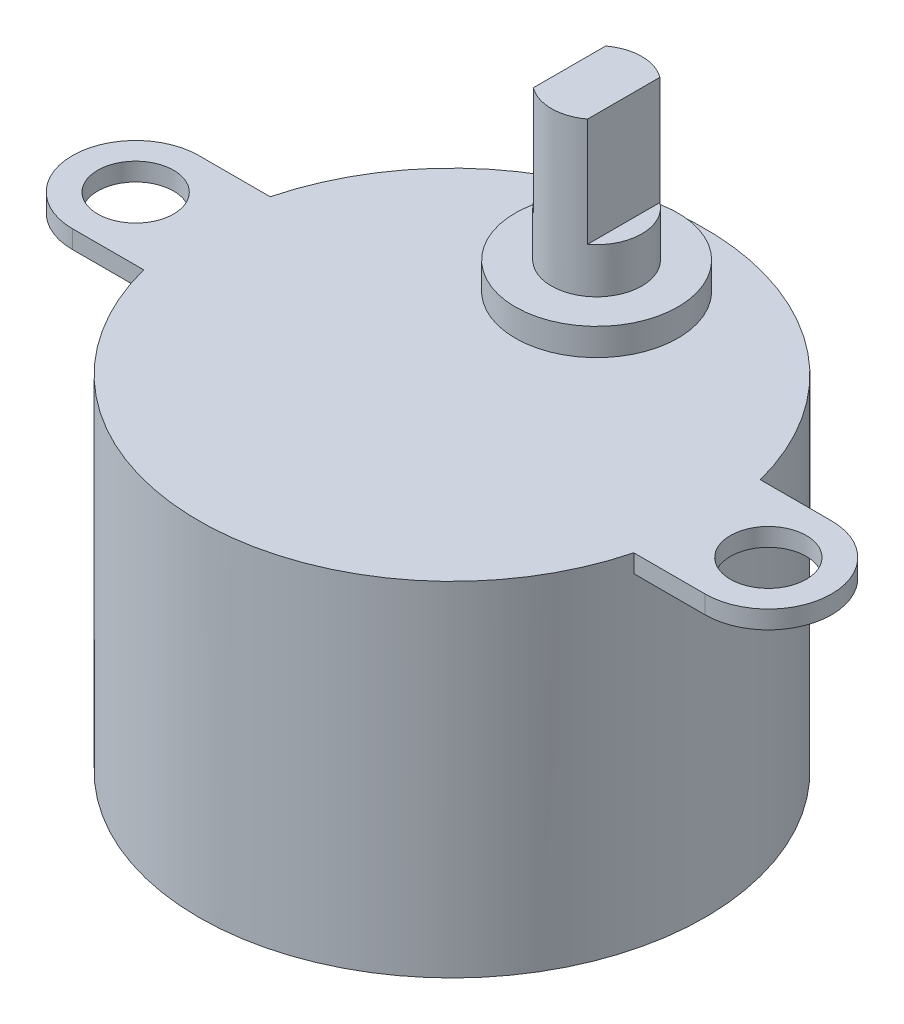
ISO-10303-21;
HEADER;
FILE_DESCRIPTION(('STEP AP214'),'2;1');
FILE_NAME('part.step','',(''),(''),'','','');
FILE_SCHEMA(('AUTOMOTIVE_DESIGN { 1 0 10303 214 1 1 1 1 }'));
ENDSEC;
DATA;
#1=APPLICATION_CONTEXT('core data for automotive mechanical design processes');
#2=APPLICATION_PROTOCOL_DEFINITION('international standard','automotive_design',2000,#1);
#3=PRODUCT_CONTEXT('',#1,'mechanical');
#4=PRODUCT('Part','Part','',(#3));
#5=PRODUCT_RELATED_PRODUCT_CATEGORY('part','',(#4));
#6=PRODUCT_DEFINITION_FORMATION('','',#4);
#7=PRODUCT_DEFINITION_CONTEXT('part definition',#1,'design');
#8=PRODUCT_DEFINITION('design','',#6,#7);
#9=PRODUCT_DEFINITION_SHAPE('','',#8);
#10=(LENGTH_UNIT() NAMED_UNIT(*) SI_UNIT(.MILLI.,.METRE.));
#11=(NAMED_UNIT(*) PLANE_ANGLE_UNIT() SI_UNIT($,.RADIAN.));
#12=(NAMED_UNIT(*) SI_UNIT($,.STERADIAN.) SOLID_ANGLE_UNIT());
#13=UNCERTAINTY_MEASURE_WITH_UNIT(LENGTH_MEASURE(1.E-05),#10,'distance_accuracy_value','');
#14=(GEOMETRIC_REPRESENTATION_CONTEXT(3) GLOBAL_UNCERTAINTY_ASSIGNED_CONTEXT((#13)) GLOBAL_UNIT_ASSIGNED_CONTEXT((#10,
#11,#12)) REPRESENTATION_CONTEXT('',''));
#15=CARTESIAN_POINT('',(0.,0.,0.));
#16=DIRECTION('',(0.,0.,1.));
#17=DIRECTION('',(1.,0.,0.));
#18=AXIS2_PLACEMENT_3D('',#15,#16,#17);
#19=CARTESIAN_POINT('',(0.,23.,-8.));
#20=DIRECTION('',(0.,1.,0.));
#21=DIRECTION('',(0.,0.,1.));
#22=AXIS2_PLACEMENT_3D('',#19,#20,#21);
#23=PLANE('',#22);
#24=DIRECTION('',(0.,0.,-1.));
#25=VECTOR('',#24,1.);
#26=CARTESIAN_POINT('',(1.5,23.,-10.));
#27=LINE('',#26,#25);
#28=CARTESIAN_POINT('',(1.5,23.,-6.));
#29=VERTEX_POINT('',#28);
#30=CARTESIAN_POINT('',(1.5,23.,-10.));
#31=VERTEX_POINT('',#30);
#32=EDGE_CURVE('E146',#29,#31,#27,.T.);
#33=ORIENTED_EDGE('',*,*,#32,.F.);
#34=CARTESIAN_POINT('',(0.,23.,-8.));
#35=DIRECTION('',(0.,1.,0.));
#36=DIRECTION('',(0.,0.,1.));
#37=AXIS2_PLACEMENT_3D('',#34,#35,#36);
#38=CIRCLE('',#37,2.5);
#39=EDGE_CURVE('E59',#29,#31,#38,.T.);
#40=ORIENTED_EDGE('',*,*,#39,.T.);
#41=EDGE_LOOP('',(#33,#40));
#42=FACE_BOUND('',#41,.T.);
#43=ADVANCED_FACE('F36',(#42),#23,.T.);
#44=CARTESIAN_POINT('',(0.,19.,0.));
#45=DIRECTION('',(0.,-1.,0.));
#46=DIRECTION('',(0.,0.,-1.));
#47=AXIS2_PLACEMENT_3D('',#44,#45,#46);
#48=CYLINDRICAL_SURFACE('',#47,14.);
#49=CARTESIAN_POINT('',(0.,19.,0.));
#50=DIRECTION('',(0.,1.,0.));
#51=DIRECTION('',(0.,0.,1.));
#52=AXIS2_PLACEMENT_3D('',#49,#50,#51);
#53=CIRCLE('',#52,14.);
#54=CARTESIAN_POINT('',(13.555441711726,19.,-3.5));
#55=VERTEX_POINT('',#54);
#56=CARTESIAN_POINT('',(-13.555441711726,19.,-3.5));
#57=VERTEX_POINT('',#56);
#58=EDGE_CURVE('E226',#55,#57,#53,.T.);
#59=ORIENTED_EDGE('',*,*,#58,.F.);
#60=DIRECTION('',(0.,-1.,0.));
#61=VECTOR('',#60,1.);
#62=CARTESIAN_POINT('',(13.555441711726,19.,-3.5));
#63=LINE('',#62,#61);
#64=CARTESIAN_POINT('',(13.555441711726,18.,-3.5));
#65=VERTEX_POINT('',#64);
#66=EDGE_CURVE('E220',#55,#65,#63,.T.);
#67=ORIENTED_EDGE('',*,*,#66,.T.);
#68=CARTESIAN_POINT('',(0.,18.,0.));
#69=DIRECTION('',(0.,1.,0.));
#70=DIRECTION('',(0.,0.,1.));
#71=AXIS2_PLACEMENT_3D('',#68,#69,#70);
#72=CIRCLE('',#71,14.);
#73=CARTESIAN_POINT('',(13.555441711726,18.,3.5));
#74=VERTEX_POINT('',#73);
#75=EDGE_CURVE('E45',#74,#65,#72,.T.);
#76=ORIENTED_EDGE('',*,*,#75,.F.);
#77=DIRECTION('',(0.,-1.,0.));
#78=VECTOR('',#77,1.);
#79=CARTESIAN_POINT('',(13.555441711726,19.,3.5));
#80=LINE('',#79,#78);
#81=CARTESIAN_POINT('',(13.555441711726,19.,3.5));
#82=VERTEX_POINT('',#81);
#83=EDGE_CURVE('E205',#74,#82,#80,.F.);
#84=ORIENTED_EDGE('',*,*,#83,.T.);
#85=CARTESIAN_POINT('',(-13.555441711726,19.,3.5));
#86=VERTEX_POINT('',#85);
#87=EDGE_CURVE('E224',#86,#82,#53,.T.);
#88=ORIENTED_EDGE('',*,*,#87,.F.);
#89=DIRECTION('',(0.,-1.,0.));
#90=VECTOR('',#89,1.);
#91=CARTESIAN_POINT('',(-13.555441711726,19.,3.5));
#92=LINE('',#91,#90);
#93=CARTESIAN_POINT('',(-13.555441711726,18.,3.5));
#94=VERTEX_POINT('',#93);
#95=EDGE_CURVE('E214',#86,#94,#92,.T.);
#96=ORIENTED_EDGE('',*,*,#95,.T.);
#97=CARTESIAN_POINT('',(-13.555441711726,18.,-3.5));
#98=VERTEX_POINT('',#97);
#99=EDGE_CURVE('E40',#98,#94,#72,.T.);
#100=ORIENTED_EDGE('',*,*,#99,.F.);
#101=DIRECTION('',(0.,-1.,0.));
#102=VECTOR('',#101,1.);
#103=CARTESIAN_POINT('',(-13.555441711726,19.,-3.5));
#104=LINE('',#103,#102);
#105=EDGE_CURVE('E217',#98,#57,#104,.F.);
#106=ORIENTED_EDGE('',*,*,#105,.T.);
#107=EDGE_LOOP('',(#59,#67,#76,#84,#88,#96,#100,#106));
#108=FACE_BOUND('',#107,.T.);
#109=CARTESIAN_POINT('',(0.,0.,0.));
#110=DIRECTION('',(0.,1.,0.));
#111=DIRECTION('',(0.,0.,1.));
#112=AXIS2_PLACEMENT_3D('',#109,#110,#111);
#113=CIRCLE('',#112,14.);
#114=CARTESIAN_POINT('',(0.,0.,14.));
#115=VERTEX_POINT('',#114);
#116=EDGE_CURVE('E223',#115,#115,#113,.T.);
#117=ORIENTED_EDGE('',*,*,#116,.T.);
#118=EDGE_LOOP('',(#117));
#119=FACE_BOUND('',#118,.T.);
#120=ADVANCED_FACE('F38',(#108,#119),#48,.T.);
#121=CARTESIAN_POINT('',(0.,19.,0.));
#122=DIRECTION('',(0.,1.,0.));
#123=DIRECTION('',(0.,0.,1.));
#124=AXIS2_PLACEMENT_3D('',#121,#122,#123);
#125=PLANE('',#124);
#126=CARTESIAN_POINT('',(0.,19.,-8.));
#127=DIRECTION('',(0.,1.,0.));
#128=DIRECTION('',(0.,0.,1.));
#129=AXIS2_PLACEMENT_3D('',#126,#127,#128);
#130=CIRCLE('',#129,4.5);
#131=CARTESIAN_POINT('',(0.,19.,-3.5));
#132=VERTEX_POINT('',#131);
#133=EDGE_CURVE('E156',#132,#132,#130,.T.);
#134=ORIENTED_EDGE('',*,*,#133,.F.);
#135=EDGE_LOOP('',(#134));
#136=FACE_BOUND('',#135,.T.);
#137=ORIENTED_EDGE('',*,*,#87,.T.);
#138=DIRECTION('',(1.,0.,0.));
#139=VECTOR('',#138,1.);
#140=CARTESIAN_POINT('',(-17.5,19.,3.5));
#141=LINE('',#140,#139);
#142=CARTESIAN_POINT('',(17.5,19.,3.5));
#143=VERTEX_POINT('',#142);
#144=EDGE_CURVE('E194',#82,#143,#141,.T.);
#145=ORIENTED_EDGE('',*,*,#144,.T.);
#146=CARTESIAN_POINT('',(17.5,19.,0.));
#147=DIRECTION('',(0.,1.,0.));
#148=DIRECTION('',(0.,0.,1.));
#149=AXIS2_PLACEMENT_3D('',#146,#147,#148);
#150=CIRCLE('',#149,3.5);
#151=CARTESIAN_POINT('',(17.5,19.,-3.5));
#152=VERTEX_POINT('',#151);
#153=EDGE_CURVE('E197',#143,#152,#150,.T.);
#154=ORIENTED_EDGE('',*,*,#153,.T.);
#155=DIRECTION('',(-1.,0.,0.));
#156=VECTOR('',#155,1.);
#157=CARTESIAN_POINT('',(-17.5,19.,-3.5));
#158=LINE('',#157,#156);
#159=EDGE_CURVE('E180',#152,#55,#158,.T.);
#160=ORIENTED_EDGE('',*,*,#159,.T.);
#161=ORIENTED_EDGE('',*,*,#58,.T.);
#162=CARTESIAN_POINT('',(-17.5,19.,-3.5));
#163=VERTEX_POINT('',#162);
#164=EDGE_CURVE('E200',#57,#163,#158,.T.);
#165=ORIENTED_EDGE('',*,*,#164,.T.);
#166=CARTESIAN_POINT('',(-17.5,19.,0.));
#167=DIRECTION('',(0.,1.,0.));
#168=DIRECTION('',(0.,0.,1.));
#169=AXIS2_PLACEMENT_3D('',#166,#167,#168);
#170=CIRCLE('',#169,3.5);
#171=CARTESIAN_POINT('',(-17.5,19.,3.5));
#172=VERTEX_POINT('',#171);
#173=EDGE_CURVE('E173',#163,#172,#170,.T.);
#174=ORIENTED_EDGE('',*,*,#173,.T.);
#175=EDGE_CURVE('E195',#172,#86,#141,.T.);
#176=ORIENTED_EDGE('',*,*,#175,.T.);
#177=EDGE_LOOP('',(#137,#145,#154,#160,#161,#165,#174,#176));
#178=FACE_BOUND('',#177,.T.);
#179=CARTESIAN_POINT('',(-17.5,19.,0.));
#180=DIRECTION('',(0.,1.,0.));
#181=DIRECTION('',(0.,0.,1.));
#182=AXIS2_PLACEMENT_3D('',#179,#180,#181);
#183=CIRCLE('',#182,2.1);
#184=CARTESIAN_POINT('',(-17.5,19.,2.1));
#185=VERTEX_POINT('',#184);
#186=EDGE_CURVE('E167',#185,#185,#183,.T.);
#187=ORIENTED_EDGE('',*,*,#186,.F.);
#188=EDGE_LOOP('',(#187));
#189=FACE_BOUND('',#188,.T.);
#190=CARTESIAN_POINT('',(17.5,19.,0.));
#191=DIRECTION('',(0.,1.,0.));
#192=DIRECTION('',(0.,0.,1.));
#193=AXIS2_PLACEMENT_3D('',#190,#191,#192);
#194=CIRCLE('',#193,2.1);
#195=CARTESIAN_POINT('',(17.5,19.,2.1));
#196=VERTEX_POINT('',#195);
#197=EDGE_CURVE('E161',#196,#196,#194,.T.);
#198=ORIENTED_EDGE('',*,*,#197,.F.);
#199=EDGE_LOOP('',(#198));
#200=FACE_BOUND('',#199,.T.);
#201=ADVANCED_FACE('F234',(#136,#178,#189,#200),#125,.T.);
#202=CARTESIAN_POINT('',(0.,0.,0.));
#203=DIRECTION('',(0.,1.,0.));
#204=DIRECTION('',(0.,0.,1.));
#205=AXIS2_PLACEMENT_3D('',#202,#203,#204);
#206=PLANE('',#205);
#207=ORIENTED_EDGE('',*,*,#116,.F.);
#208=EDGE_LOOP('',(#207));
#209=FACE_BOUND('',#208,.T.);
#210=ADVANCED_FACE('F231',(#209),#206,.F.);
#211=CARTESIAN_POINT('',(-17.5,18.,0.));
#212=DIRECTION('',(0.,1.,0.));
#213=DIRECTION('',(0.,0.,1.));
#214=AXIS2_PLACEMENT_3D('',#211,#212,#213);
#215=CYLINDRICAL_SURFACE('',#214,2.1);
#216=CARTESIAN_POINT('',(-17.5,18.,0.));
#217=DIRECTION('',(0.,1.,0.));
#218=DIRECTION('',(0.,0.,1.));
#219=AXIS2_PLACEMENT_3D('',#216,#217,#218);
#220=CIRCLE('',#219,2.1);
#221=CARTESIAN_POINT('',(-17.5,18.,2.1));
#222=VERTEX_POINT('',#221);
#223=EDGE_CURVE('E170',#222,#222,#220,.T.);
#224=ORIENTED_EDGE('',*,*,#223,.F.);
#225=EDGE_LOOP('',(#224));
#226=FACE_BOUND('',#225,.T.);
#227=ORIENTED_EDGE('',*,*,#186,.T.);
#228=EDGE_LOOP('',(#227));
#229=FACE_BOUND('',#228,.T.);
#230=ADVANCED_FACE('F233',(#226,#229),#215,.F.);
#231=CARTESIAN_POINT('',(-17.5,18.,0.));
#232=DIRECTION('',(0.,1.,0.));
#233=DIRECTION('',(0.,0.,1.));
#234=AXIS2_PLACEMENT_3D('',#231,#232,#233);
#235=CYLINDRICAL_SURFACE('',#234,3.5);
#236=ORIENTED_EDGE('',*,*,#173,.F.);
#237=DIRECTION('',(0.,1.,0.));
#238=VECTOR('',#237,1.);
#239=CARTESIAN_POINT('',(-17.5,18.,-3.5));
#240=LINE('',#239,#238);
#241=CARTESIAN_POINT('',(-17.5,18.,-3.5));
#242=VERTEX_POINT('',#241);
#243=EDGE_CURVE('E202',#242,#163,#240,.T.);
#244=ORIENTED_EDGE('',*,*,#243,.F.);
#245=CARTESIAN_POINT('',(-17.5,18.,0.));
#246=DIRECTION('',(0.,1.,0.));
#247=DIRECTION('',(0.,0.,1.));
#248=AXIS2_PLACEMENT_3D('',#245,#246,#247);
#249=CIRCLE('',#248,3.5);
#250=CARTESIAN_POINT('',(-17.5,18.,3.5));
#251=VERTEX_POINT('',#250);
#252=EDGE_CURVE('E176',#242,#251,#249,.T.);
#253=ORIENTED_EDGE('',*,*,#252,.T.);
#254=DIRECTION('',(0.,1.,0.));
#255=VECTOR('',#254,1.);
#256=CARTESIAN_POINT('',(-17.5,18.,3.5));
#257=LINE('',#256,#255);
#258=EDGE_CURVE('E191',#251,#172,#257,.T.);
#259=ORIENTED_EDGE('',*,*,#258,.T.);
#260=EDGE_LOOP('',(#236,#244,#253,#259));
#261=FACE_BOUND('',#260,.T.);
#262=ADVANCED_FACE('F239',(#261),#235,.T.);
#263=CARTESIAN_POINT('',(-17.5,18.,0.));
#264=DIRECTION('',(0.,1.,0.));
#265=DIRECTION('',(0.,0.,1.));
#266=AXIS2_PLACEMENT_3D('',#263,#264,#265);
#267=PLANE('',#266);
#268=ORIENTED_EDGE('',*,*,#223,.T.);
#269=EDGE_LOOP('',(#268));
#270=FACE_BOUND('',#269,.T.);
#271=DIRECTION('',(-1.,0.,0.));
#272=VECTOR('',#271,1.);
#273=CARTESIAN_POINT('',(-17.5,18.,-3.5));
#274=LINE('',#273,#272);
#275=EDGE_CURVE('E187',#98,#242,#274,.T.);
#276=ORIENTED_EDGE('',*,*,#275,.F.);
#277=ORIENTED_EDGE('',*,*,#99,.T.);
#278=DIRECTION('',(1.,0.,0.));
#279=VECTOR('',#278,1.);
#280=CARTESIAN_POINT('',(-17.5,18.,3.5));
#281=LINE('',#280,#279);
#282=EDGE_CURVE('E181',#251,#94,#281,.T.);
#283=ORIENTED_EDGE('',*,*,#282,.F.);
#284=ORIENTED_EDGE('',*,*,#252,.F.);
#285=EDGE_LOOP('',(#276,#277,#283,#284));
#286=FACE_BOUND('',#285,.T.);
#287=ADVANCED_FACE('F275',(#270,#286),#267,.F.);
#288=CARTESIAN_POINT('',(-17.5,18.,3.5));
#289=DIRECTION('',(0.,0.,1.));
#290=DIRECTION('',(1.,0.,0.));
#291=AXIS2_PLACEMENT_3D('',#288,#289,#290);
#292=PLANE('',#291);
#293=ORIENTED_EDGE('',*,*,#95,.F.);
#294=ORIENTED_EDGE('',*,*,#175,.F.);
#295=ORIENTED_EDGE('',*,*,#258,.F.);
#296=ORIENTED_EDGE('',*,*,#282,.T.);
#297=EDGE_LOOP('',(#293,#294,#295,#296));
#298=FACE_BOUND('',#297,.T.);
#299=ADVANCED_FACE('F278',(#298),#292,.T.);
#300=CARTESIAN_POINT('',(-17.5,18.,-3.5));
#301=DIRECTION('',(0.,0.,-1.));
#302=DIRECTION('',(-1.,0.,0.));
#303=AXIS2_PLACEMENT_3D('',#300,#301,#302);
#304=PLANE('',#303);
#305=ORIENTED_EDGE('',*,*,#105,.F.);
#306=ORIENTED_EDGE('',*,*,#275,.T.);
#307=ORIENTED_EDGE('',*,*,#243,.T.);
#308=ORIENTED_EDGE('',*,*,#164,.F.);
#309=EDGE_LOOP('',(#305,#306,#307,#308));
#310=FACE_BOUND('',#309,.T.);
#311=ADVANCED_FACE('F286',(#310),#304,.T.);
#312=CARTESIAN_POINT('',(17.5,18.,0.));
#313=DIRECTION('',(0.,1.,0.));
#314=DIRECTION('',(0.,0.,1.));
#315=AXIS2_PLACEMENT_3D('',#312,#313,#314);
#316=CIRCLE('',#315,2.1);
#317=CARTESIAN_POINT('',(17.5,18.,2.1));
#318=VERTEX_POINT('',#317);
#319=EDGE_CURVE('E164',#318,#318,#316,.T.);
#320=ORIENTED_EDGE('',*,*,#319,.T.);
#321=EDGE_LOOP('',(#320));
#322=FACE_BOUND('',#321,.T.);
#323=CARTESIAN_POINT('',(17.5,18.,3.5));
#324=VERTEX_POINT('',#323);
#325=EDGE_CURVE('E179',#74,#324,#281,.T.);
#326=ORIENTED_EDGE('',*,*,#325,.F.);
#327=ORIENTED_EDGE('',*,*,#75,.T.);
#328=CARTESIAN_POINT('',(17.5,18.,-3.5));
#329=VERTEX_POINT('',#328);
#330=EDGE_CURVE('E188',#329,#65,#274,.T.);
#331=ORIENTED_EDGE('',*,*,#330,.F.);
#332=CARTESIAN_POINT('',(17.5,18.,0.));
#333=DIRECTION('',(0.,1.,0.));
#334=DIRECTION('',(0.,0.,1.));
#335=AXIS2_PLACEMENT_3D('',#332,#333,#334);
#336=CIRCLE('',#335,3.5);
#337=EDGE_CURVE('E184',#324,#329,#336,.T.);
#338=ORIENTED_EDGE('',*,*,#337,.F.);
#339=EDGE_LOOP('',(#326,#327,#331,#338));
#340=FACE_BOUND('',#339,.T.);
#341=ADVANCED_FACE('F280',(#322,#340),#267,.F.);
#342=ORIENTED_EDGE('',*,*,#66,.F.);
#343=ORIENTED_EDGE('',*,*,#159,.F.);
#344=DIRECTION('',(0.,1.,0.));
#345=VECTOR('',#344,1.);
#346=CARTESIAN_POINT('',(17.5,18.,-3.5));
#347=LINE('',#346,#345);
#348=EDGE_CURVE('E206',#329,#152,#347,.T.);
#349=ORIENTED_EDGE('',*,*,#348,.F.);
#350=ORIENTED_EDGE('',*,*,#330,.T.);
#351=EDGE_LOOP('',(#342,#343,#349,#350));
#352=FACE_BOUND('',#351,.T.);
#353=ADVANCED_FACE('F281',(#352),#304,.T.);
#354=ORIENTED_EDGE('',*,*,#83,.F.);
#355=ORIENTED_EDGE('',*,*,#325,.T.);
#356=DIRECTION('',(0.,1.,0.));
#357=VECTOR('',#356,1.);
#358=CARTESIAN_POINT('',(17.5,18.,3.5));
#359=LINE('',#358,#357);
#360=EDGE_CURVE('E208',#324,#143,#359,.T.);
#361=ORIENTED_EDGE('',*,*,#360,.T.);
#362=ORIENTED_EDGE('',*,*,#144,.F.);
#363=EDGE_LOOP('',(#354,#355,#361,#362));
#364=FACE_BOUND('',#363,.T.);
#365=ADVANCED_FACE('F284',(#364),#292,.T.);
#366=CARTESIAN_POINT('',(17.5,18.,0.));
#367=DIRECTION('',(0.,1.,0.));
#368=DIRECTION('',(0.,0.,1.));
#369=AXIS2_PLACEMENT_3D('',#366,#367,#368);
#370=CYLINDRICAL_SURFACE('',#369,3.5);
#371=ORIENTED_EDGE('',*,*,#153,.F.);
#372=ORIENTED_EDGE('',*,*,#360,.F.);
#373=ORIENTED_EDGE('',*,*,#337,.T.);
#374=ORIENTED_EDGE('',*,*,#348,.T.);
#375=EDGE_LOOP('',(#371,#372,#373,#374));
#376=FACE_BOUND('',#375,.T.);
#377=ADVANCED_FACE('F272',(#376),#370,.T.);
#378=CARTESIAN_POINT('',(17.5,18.,0.));
#379=DIRECTION('',(0.,1.,0.));
#380=DIRECTION('',(0.,0.,1.));
#381=AXIS2_PLACEMENT_3D('',#378,#379,#380);
#382=CYLINDRICAL_SURFACE('',#381,2.1);
#383=ORIENTED_EDGE('',*,*,#319,.F.);
#384=EDGE_LOOP('',(#383));
#385=FACE_BOUND('',#384,.T.);
#386=ORIENTED_EDGE('',*,*,#197,.T.);
#387=EDGE_LOOP('',(#386));
#388=FACE_BOUND('',#387,.T.);
#389=ADVANCED_FACE('F269',(#385,#388),#382,.F.);
#390=CARTESIAN_POINT('',(0.,20.5,-8.));
#391=DIRECTION('',(0.,-1.,0.));
#392=DIRECTION('',(0.,0.,-1.));
#393=AXIS2_PLACEMENT_3D('',#390,#391,#392);
#394=CYLINDRICAL_SURFACE('',#393,4.5);
#395=CARTESIAN_POINT('',(0.,20.5,-8.));
#396=DIRECTION('',(0.,1.,0.));
#397=DIRECTION('',(0.,0.,1.));
#398=AXIS2_PLACEMENT_3D('',#395,#396,#397);
#399=CIRCLE('',#398,4.5);
#400=CARTESIAN_POINT('',(0.,20.5,-3.5));
#401=VERTEX_POINT('',#400);
#402=EDGE_CURVE('E158',#401,#401,#399,.T.);
#403=ORIENTED_EDGE('',*,*,#402,.F.);
#404=EDGE_LOOP('',(#403));
#405=FACE_BOUND('',#404,.T.);
#406=ORIENTED_EDGE('',*,*,#133,.T.);
#407=EDGE_LOOP('',(#406));
#408=FACE_BOUND('',#407,.T.);
#409=ADVANCED_FACE('F263',(#405,#408),#394,.T.);
#410=CARTESIAN_POINT('',(0.,20.5,-8.));
#411=DIRECTION('',(0.,1.,0.));
#412=DIRECTION('',(0.,0.,1.));
#413=AXIS2_PLACEMENT_3D('',#410,#411,#412);
#414=PLANE('',#413);
#415=CARTESIAN_POINT('',(0.,20.5,-8.));
#416=DIRECTION('',(0.,1.,0.));
#417=DIRECTION('',(0.,0.,1.));
#418=AXIS2_PLACEMENT_3D('',#415,#416,#417);
#419=CIRCLE('',#418,2.5);
#420=CARTESIAN_POINT('',(0.,20.5,-5.5));
#421=VERTEX_POINT('',#420);
#422=EDGE_CURVE('E11',#421,#421,#419,.T.);
#423=ORIENTED_EDGE('',*,*,#422,.F.);
#424=EDGE_LOOP('',(#423));
#425=FACE_BOUND('',#424,.T.);
#426=ORIENTED_EDGE('',*,*,#402,.T.);
#427=EDGE_LOOP('',(#426));
#428=FACE_BOUND('',#427,.T.);
#429=ADVANCED_FACE('F259',(#425,#428),#414,.T.);
#430=CARTESIAN_POINT('',(0.,23.,-8.));
#431=DIRECTION('',(0.,-1.,0.));
#432=DIRECTION('',(0.,0.,-1.));
#433=AXIS2_PLACEMENT_3D('',#430,#431,#432);
#434=CYLINDRICAL_SURFACE('',#433,2.5);
#435=ORIENTED_EDGE('',*,*,#39,.F.);
#436=DIRECTION('',(0.,-1.,0.));
#437=VECTOR('',#436,1.);
#438=CARTESIAN_POINT('',(1.5,29.,-6.));
#439=LINE('',#438,#437);
#440=CARTESIAN_POINT('',(1.5,29.,-6.));
#441=VERTEX_POINT('',#440);
#442=EDGE_CURVE('E153',#441,#29,#439,.T.);
#443=ORIENTED_EDGE('',*,*,#442,.F.);
#444=CARTESIAN_POINT('',(0.,29.,-8.));
#445=DIRECTION('',(0.,1.,0.));
#446=DIRECTION('',(0.,0.,1.));
#447=AXIS2_PLACEMENT_3D('',#444,#445,#446);
#448=CIRCLE('',#447,2.5);
#449=CARTESIAN_POINT('',(-1.5,29.,-6.));
#450=VERTEX_POINT('',#449);
#451=EDGE_CURVE('E136',#450,#441,#448,.T.);
#452=ORIENTED_EDGE('',*,*,#451,.F.);
#453=DIRECTION('',(0.,-1.,0.));
#454=VECTOR('',#453,1.);
#455=CARTESIAN_POINT('',(-1.5,29.,-6.));
#456=LINE('',#455,#454);
#457=CARTESIAN_POINT('',(-1.5,23.,-6.));
#458=VERTEX_POINT('',#457);
#459=EDGE_CURVE('E133',#450,#458,#456,.T.);
#460=ORIENTED_EDGE('',*,*,#459,.T.);
#461=CARTESIAN_POINT('',(-1.5,23.,-10.));
#462=VERTEX_POINT('',#461);
#463=EDGE_CURVE('E150',#462,#458,#38,.T.);
#464=ORIENTED_EDGE('',*,*,#463,.F.);
#465=DIRECTION('',(0.,-1.,0.));
#466=VECTOR('',#465,1.);
#467=CARTESIAN_POINT('',(-1.5,29.,-10.));
#468=LINE('',#467,#466);
#469=CARTESIAN_POINT('',(-1.5,29.,-10.));
#470=VERTEX_POINT('',#469);
#471=EDGE_CURVE('E131',#470,#462,#468,.T.);
#472=ORIENTED_EDGE('',*,*,#471,.F.);
#473=CARTESIAN_POINT('',(0.,29.,-8.));
#474=DIRECTION('',(0.,1.,0.));
#475=DIRECTION('',(0.,0.,1.));
#476=AXIS2_PLACEMENT_3D('',#473,#474,#475);
#477=CIRCLE('',#476,2.5);
#478=CARTESIAN_POINT('',(1.5,29.,-10.));
#479=VERTEX_POINT('',#478);
#480=EDGE_CURVE('E137',#479,#470,#477,.T.);
#481=ORIENTED_EDGE('',*,*,#480,.F.);
#482=DIRECTION('',(0.,-1.,0.));
#483=VECTOR('',#482,1.);
#484=CARTESIAN_POINT('',(1.5,29.,-10.));
#485=LINE('',#484,#483);
#486=EDGE_CURVE('E387',#479,#31,#485,.T.);
#487=ORIENTED_EDGE('',*,*,#486,.T.);
#488=EDGE_LOOP('',(#435,#443,#452,#460,#464,#472,#481,#487));
#489=FACE_BOUND('',#488,.T.);
#490=ORIENTED_EDGE('',*,*,#422,.T.);
#491=EDGE_LOOP('',(#490));
#492=FACE_BOUND('',#491,.T.);
#493=ADVANCED_FACE('F148',(#489,#492),#434,.T.);
#494=DIRECTION('',(0.,0.,1.));
#495=VECTOR('',#494,1.);
#496=CARTESIAN_POINT('',(-1.5,23.,-10.));
#497=LINE('',#496,#495);
#498=EDGE_CURVE('E52',#462,#458,#497,.T.);
#499=ORIENTED_EDGE('',*,*,#498,.F.);
#500=ORIENTED_EDGE('',*,*,#463,.T.);
#501=EDGE_LOOP('',(#499,#500));
#502=FACE_BOUND('',#501,.T.);
#503=ADVANCED_FACE('F246',(#502),#23,.T.);
#504=CARTESIAN_POINT('',(-1.5,29.,-10.));
#505=DIRECTION('',(1.,0.,0.));
#506=DIRECTION('',(0.,0.,-1.));
#507=AXIS2_PLACEMENT_3D('',#504,#505,#506);
#508=PLANE('',#507);
#509=ORIENTED_EDGE('',*,*,#498,.T.);
#510=ORIENTED_EDGE('',*,*,#459,.F.);
#511=DIRECTION('',(0.,0.,1.));
#512=VECTOR('',#511,1.);
#513=CARTESIAN_POINT('',(-1.5,29.,-10.));
#514=LINE('',#513,#512);
#515=EDGE_CURVE('E127',#470,#450,#514,.T.);
#516=ORIENTED_EDGE('',*,*,#515,.F.);
#517=ORIENTED_EDGE('',*,*,#471,.T.);
#518=EDGE_LOOP('',(#509,#510,#516,#517));
#519=FACE_BOUND('',#518,.T.);
#520=ADVANCED_FACE('F129',(#519),#508,.F.);
#521=CARTESIAN_POINT('',(1.5,29.,-10.));
#522=DIRECTION('',(-1.,0.,0.));
#523=DIRECTION('',(0.,0.,1.));
#524=AXIS2_PLACEMENT_3D('',#521,#522,#523);
#525=PLANE('',#524);
#526=ORIENTED_EDGE('',*,*,#32,.T.);
#527=ORIENTED_EDGE('',*,*,#486,.F.);
#528=DIRECTION('',(0.,0.,-1.));
#529=VECTOR('',#528,1.);
#530=CARTESIAN_POINT('',(1.5,29.,-10.));
#531=LINE('',#530,#529);
#532=EDGE_CURVE('E142',#441,#479,#531,.T.);
#533=ORIENTED_EDGE('',*,*,#532,.F.);
#534=ORIENTED_EDGE('',*,*,#442,.T.);
#535=EDGE_LOOP('',(#526,#527,#533,#534));
#536=FACE_BOUND('',#535,.T.);
#537=ADVANCED_FACE('F258',(#536),#525,.F.);
#538=CARTESIAN_POINT('',(0.,29.,-8.));
#539=DIRECTION('',(0.,1.,0.));
#540=DIRECTION('',(0.,0.,1.));
#541=AXIS2_PLACEMENT_3D('',#538,#539,#540);
#542=PLANE('',#541);
#543=ORIENTED_EDGE('',*,*,#480,.T.);
#544=ORIENTED_EDGE('',*,*,#515,.T.);
#545=ORIENTED_EDGE('',*,*,#451,.T.);
#546=ORIENTED_EDGE('',*,*,#532,.T.);
#547=EDGE_LOOP('',(#543,#544,#545,#546));
#548=FACE_BOUND('',#547,.T.);
#549=ADVANCED_FACE('F140',(#548),#542,.T.);
#550=CLOSED_SHELL('',(#43,#120,#201,#210,#230,#262,#287,#299,#311,#341,#353,#365,#377,#389,#409,
#429,#493,#503,#520,#537,#549));
#551=MANIFOLD_SOLID_BREP('B2',#550);
#552=ADVANCED_BREP_SHAPE_REPRESENTATION('',(#18,#551),#14);
#553=SHAPE_DEFINITION_REPRESENTATION(#9,#552);
ENDSEC;
END-ISO-10303-21;
